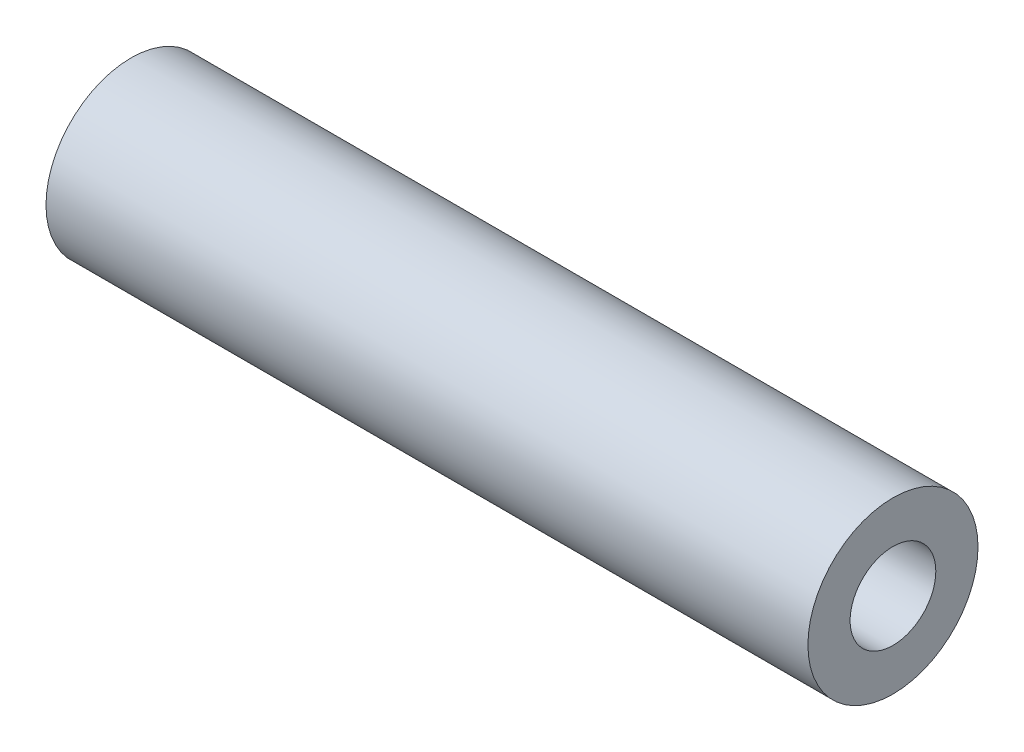
ISO-10303-21;
HEADER;
FILE_DESCRIPTION(('STEP AP214'),'2;1');
FILE_NAME('part.step','',(''),(''),'','','');
FILE_SCHEMA(('AUTOMOTIVE_DESIGN { 1 0 10303 214 1 1 1 1 }'));
ENDSEC;
DATA;
#1=APPLICATION_CONTEXT('core data for automotive mechanical design processes');
#2=APPLICATION_PROTOCOL_DEFINITION('international standard','automotive_design',2000,#1);
#3=PRODUCT_CONTEXT('',#1,'mechanical');
#4=PRODUCT('Part','Part','',(#3));
#5=PRODUCT_RELATED_PRODUCT_CATEGORY('part','',(#4));
#6=PRODUCT_DEFINITION_FORMATION('','',#4);
#7=PRODUCT_DEFINITION_CONTEXT('part definition',#1,'design');
#8=PRODUCT_DEFINITION('design','',#6,#7);
#9=PRODUCT_DEFINITION_SHAPE('','',#8);
#10=(LENGTH_UNIT() NAMED_UNIT(*) SI_UNIT(.MILLI.,.METRE.));
#11=(NAMED_UNIT(*) PLANE_ANGLE_UNIT() SI_UNIT($,.RADIAN.));
#12=(NAMED_UNIT(*) SI_UNIT($,.STERADIAN.) SOLID_ANGLE_UNIT());
#13=UNCERTAINTY_MEASURE_WITH_UNIT(LENGTH_MEASURE(1.E-05),#10,'distance_accuracy_value','');
#14=(GEOMETRIC_REPRESENTATION_CONTEXT(3) GLOBAL_UNCERTAINTY_ASSIGNED_CONTEXT((#13)) GLOBAL_UNIT_ASSIGNED_CONTEXT((#10,
#11,#12)) REPRESENTATION_CONTEXT('',''));
#15=CARTESIAN_POINT('',(0.,0.,0.));
#16=DIRECTION('',(0.,0.,1.));
#17=DIRECTION('',(1.,0.,0.));
#18=AXIS2_PLACEMENT_3D('',#15,#16,#17);
#19=CARTESIAN_POINT('',(28.448,0.,0.));
#20=DIRECTION('',(1.,0.,0.));
#21=DIRECTION('',(0.,0.,-1.));
#22=AXIS2_PLACEMENT_3D('',#19,#20,#21);
#23=PLANE('',#22);
#24=CARTESIAN_POINT('',(28.448,0.,0.));
#25=DIRECTION('',(1.,0.,0.));
#26=DIRECTION('',(0.,0.,-1.));
#27=AXIS2_PLACEMENT_3D('',#24,#25,#26);
#28=CIRCLE('',#27,3.175);
#29=CARTESIAN_POINT('',(28.448,0.,-3.175));
#30=VERTEX_POINT('',#29);
#31=EDGE_CURVE('E10',#30,#30,#28,.T.);
#32=ORIENTED_EDGE('',*,*,#31,.T.);
#33=EDGE_LOOP('',(#32));
#34=FACE_BOUND('',#33,.T.);
#35=CARTESIAN_POINT('',(28.448,0.,0.));
#36=DIRECTION('',(1.,0.,0.));
#37=DIRECTION('',(0.,0.,-1.));
#38=AXIS2_PLACEMENT_3D('',#35,#36,#37);
#39=CIRCLE('',#38,1.6002);
#40=CARTESIAN_POINT('',(28.448,0.,-1.6002));
#41=VERTEX_POINT('',#40);
#42=EDGE_CURVE('E41',#41,#41,#39,.T.);
#43=ORIENTED_EDGE('',*,*,#42,.F.);
#44=EDGE_LOOP('',(#43));
#45=FACE_BOUND('',#44,.T.);
#46=ADVANCED_FACE('F30',(#34,#45),#23,.T.);
#47=CARTESIAN_POINT('',(0.,0.,0.));
#48=DIRECTION('',(1.,0.,0.));
#49=DIRECTION('',(0.,0.,-1.));
#50=AXIS2_PLACEMENT_3D('',#47,#48,#49);
#51=PLANE('',#50);
#52=CARTESIAN_POINT('',(0.,0.,0.));
#53=DIRECTION('',(1.,0.,0.));
#54=DIRECTION('',(0.,0.,-1.));
#55=AXIS2_PLACEMENT_3D('',#52,#53,#54);
#56=CIRCLE('',#55,3.175);
#57=CARTESIAN_POINT('',(0.,0.,-3.175));
#58=VERTEX_POINT('',#57);
#59=EDGE_CURVE('E34',#58,#58,#56,.T.);
#60=ORIENTED_EDGE('',*,*,#59,.F.);
#61=EDGE_LOOP('',(#60));
#62=FACE_BOUND('',#61,.T.);
#63=CARTESIAN_POINT('',(0.,0.,0.));
#64=DIRECTION('',(1.,0.,0.));
#65=DIRECTION('',(0.,0.,-1.));
#66=AXIS2_PLACEMENT_3D('',#63,#64,#65);
#67=CIRCLE('',#66,1.6002);
#68=CARTESIAN_POINT('',(0.,0.,-1.6002));
#69=VERTEX_POINT('',#68);
#70=EDGE_CURVE('E43',#69,#69,#67,.T.);
#71=ORIENTED_EDGE('',*,*,#70,.T.);
#72=EDGE_LOOP('',(#71));
#73=FACE_BOUND('',#72,.T.);
#74=ADVANCED_FACE('F53',(#62,#73),#51,.F.);
#75=CARTESIAN_POINT('',(28.448,0.,0.));
#76=DIRECTION('',(-1.,0.,0.));
#77=DIRECTION('',(0.,0.,1.));
#78=AXIS2_PLACEMENT_3D('',#75,#76,#77);
#79=CYLINDRICAL_SURFACE('',#78,3.175);
#80=ORIENTED_EDGE('',*,*,#31,.F.);
#81=EDGE_LOOP('',(#80));
#82=FACE_BOUND('',#81,.T.);
#83=ORIENTED_EDGE('',*,*,#59,.T.);
#84=EDGE_LOOP('',(#83));
#85=FACE_BOUND('',#84,.T.);
#86=ADVANCED_FACE('F32',(#82,#85),#79,.T.);
#87=CARTESIAN_POINT('',(28.448,0.,0.));
#88=DIRECTION('',(-1.,0.,0.));
#89=DIRECTION('',(0.,0.,1.));
#90=AXIS2_PLACEMENT_3D('',#87,#88,#89);
#91=CYLINDRICAL_SURFACE('',#90,1.6002);
#92=ORIENTED_EDGE('',*,*,#42,.T.);
#93=EDGE_LOOP('',(#92));
#94=FACE_BOUND('',#93,.T.);
#95=ORIENTED_EDGE('',*,*,#70,.F.);
#96=EDGE_LOOP('',(#95));
#97=FACE_BOUND('',#96,.T.);
#98=ADVANCED_FACE('F49',(#94,#97),#91,.F.);
#99=CLOSED_SHELL('',(#46,#74,#86,#98));
#100=MANIFOLD_SOLID_BREP('B2',#99);
#101=ADVANCED_BREP_SHAPE_REPRESENTATION('',(#18,#100),#14);
#102=SHAPE_DEFINITION_REPRESENTATION(#9,#101);
ENDSEC;
END-ISO-10303-21;
